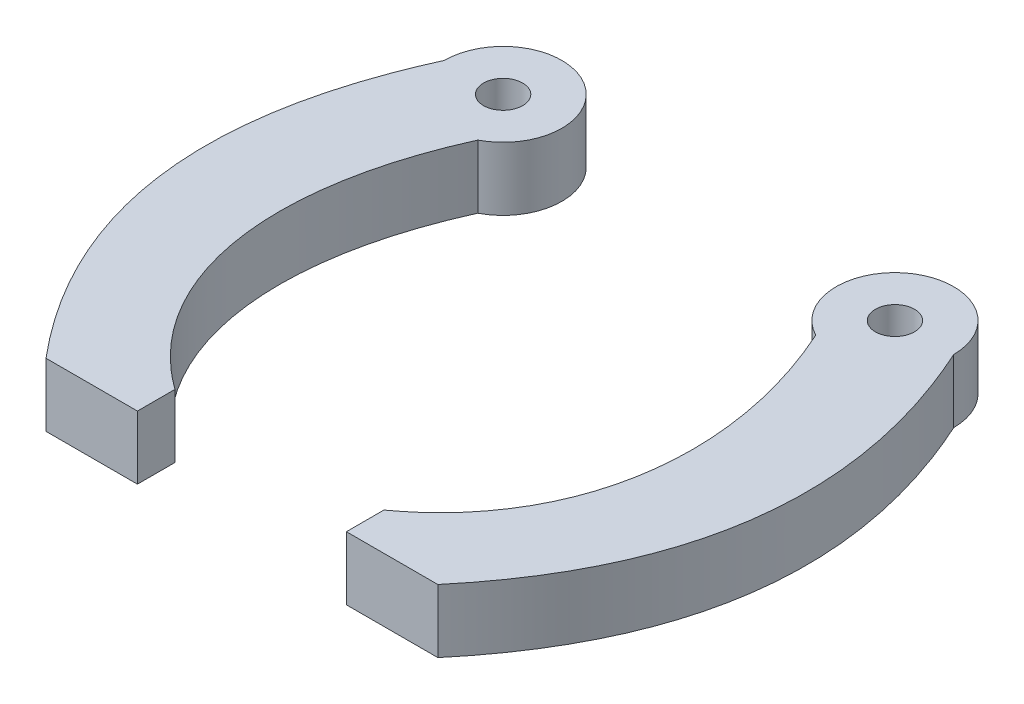
ISO-10303-21;
HEADER;
FILE_DESCRIPTION(('STEP AP214'),'2;1');
FILE_NAME('part.step','',(''),(''),'','','');
FILE_SCHEMA(('AUTOMOTIVE_DESIGN { 1 0 10303 214 1 1 1 1 }'));
ENDSEC;
DATA;
#1=APPLICATION_CONTEXT('core data for automotive mechanical design processes');
#2=APPLICATION_PROTOCOL_DEFINITION('international standard','automotive_design',2000,#1);
#3=PRODUCT_CONTEXT('',#1,'mechanical');
#4=PRODUCT('Part','Part','',(#3));
#5=PRODUCT_RELATED_PRODUCT_CATEGORY('part','',(#4));
#6=PRODUCT_DEFINITION_FORMATION('','',#4);
#7=PRODUCT_DEFINITION_CONTEXT('part definition',#1,'design');
#8=PRODUCT_DEFINITION('design','',#6,#7);
#9=PRODUCT_DEFINITION_SHAPE('','',#8);
#10=(LENGTH_UNIT() NAMED_UNIT(*) SI_UNIT(.MILLI.,.METRE.));
#11=(NAMED_UNIT(*) PLANE_ANGLE_UNIT() SI_UNIT($,.RADIAN.));
#12=(NAMED_UNIT(*) SI_UNIT($,.STERADIAN.) SOLID_ANGLE_UNIT());
#13=UNCERTAINTY_MEASURE_WITH_UNIT(LENGTH_MEASURE(1.E-05),#10,'distance_accuracy_value','');
#14=(GEOMETRIC_REPRESENTATION_CONTEXT(3) GLOBAL_UNCERTAINTY_ASSIGNED_CONTEXT((#13)) GLOBAL_UNIT_ASSIGNED_CONTEXT((#10,
#11,#12)) REPRESENTATION_CONTEXT('',''));
#15=CARTESIAN_POINT('',(0.,0.,0.));
#16=DIRECTION('',(0.,0.,1.));
#17=DIRECTION('',(1.,0.,0.));
#18=AXIS2_PLACEMENT_3D('',#15,#16,#17);
#19=CARTESIAN_POINT('',(0.,9.7,70.));
#20=DIRECTION('',(0.,0.,-1.));
#21=DIRECTION('',(-1.,0.,0.));
#22=AXIS2_PLACEMENT_3D('',#19,#20,#21);
#23=PLANE('',#22);
#24=DIRECTION('',(1.,0.,0.));
#25=VECTOR('',#24,1.);
#26=CARTESIAN_POINT('',(0.,0.,70.));
#27=LINE('',#26,#25);
#28=CARTESIAN_POINT('',(16.,0.,70.));
#29=VERTEX_POINT('',#28);
#30=CARTESIAN_POINT('',(30.,0.,70.));
#31=VERTEX_POINT('',#30);
#32=EDGE_CURVE('E153',#29,#31,#27,.T.);
#33=ORIENTED_EDGE('',*,*,#32,.T.);
#34=DIRECTION('',(0.,-1.,0.));
#35=VECTOR('',#34,1.);
#36=CARTESIAN_POINT('',(30.,9.7,70.));
#37=LINE('',#36,#35);
#38=CARTESIAN_POINT('',(30.,9.7,70.));
#39=VERTEX_POINT('',#38);
#40=EDGE_CURVE('E12',#39,#31,#37,.T.);
#41=ORIENTED_EDGE('',*,*,#40,.F.);
#42=DIRECTION('',(1.,0.,0.));
#43=VECTOR('',#42,1.);
#44=CARTESIAN_POINT('',(0.,9.7,70.));
#45=LINE('',#44,#43);
#46=CARTESIAN_POINT('',(16.,9.7,70.));
#47=VERTEX_POINT('',#46);
#48=EDGE_CURVE('E123',#47,#39,#45,.T.);
#49=ORIENTED_EDGE('',*,*,#48,.F.);
#50=DIRECTION('',(0.,-1.,0.));
#51=VECTOR('',#50,1.);
#52=CARTESIAN_POINT('',(16.,9.7,70.));
#53=LINE('',#52,#51);
#54=EDGE_CURVE('E67',#47,#29,#53,.T.);
#55=ORIENTED_EDGE('',*,*,#54,.T.);
#56=EDGE_LOOP('',(#33,#41,#49,#55));
#57=FACE_BOUND('',#56,.T.);
#58=ADVANCED_FACE('F51',(#57),#23,.F.);
#59=CARTESIAN_POINT('',(30.,9.7,70.));
#60=CARTESIAN_POINT('',(56.5320802679145,9.7,38.4962963409047));
#61=CARTESIAN_POINT('',(39.,9.7,0.));
#62=B_SPLINE_CURVE_WITH_KNOTS('',2,(#59,#60,#61),.UNSPECIFIED.,.F.,.F.,(3,3),(0.,1.),.UNSPECIFIED.);
#63=DIRECTION('',(0.,-1.,0.));
#64=VECTOR('',#63,1.);
#65=SURFACE_OF_LINEAR_EXTRUSION('',#62,#64);
#66=CARTESIAN_POINT('',(30.,0.,70.));
#67=CARTESIAN_POINT('',(56.5320802679145,0.,38.4962963409047));
#68=CARTESIAN_POINT('',(39.,0.,0.));
#69=B_SPLINE_CURVE_WITH_KNOTS('',2,(#66,#67,#68),.UNSPECIFIED.,.F.,.F.,(3,3),(0.,1.),.UNSPECIFIED.);
#70=CARTESIAN_POINT('',(39.,0.,0.));
#71=VERTEX_POINT('',#70);
#72=EDGE_CURVE('E150',#31,#71,#69,.T.);
#73=ORIENTED_EDGE('',*,*,#72,.T.);
#74=DIRECTION('',(0.,-1.,0.));
#75=VECTOR('',#74,1.);
#76=CARTESIAN_POINT('',(39.,9.7,0.));
#77=LINE('',#76,#75);
#78=CARTESIAN_POINT('',(39.,9.7,0.));
#79=VERTEX_POINT('',#78);
#80=EDGE_CURVE('E59',#79,#71,#77,.T.);
#81=ORIENTED_EDGE('',*,*,#80,.F.);
#82=EDGE_CURVE('E97',#39,#79,#62,.T.);
#83=ORIENTED_EDGE('',*,*,#82,.F.);
#84=ORIENTED_EDGE('',*,*,#40,.T.);
#85=EDGE_LOOP('',(#73,#81,#83,#84));
#86=FACE_BOUND('',#85,.T.);
#87=ADVANCED_FACE('F144',(#86),#65,.F.);
#88=CARTESIAN_POINT('',(30.,9.7,0.));
#89=DIRECTION('',(0.,-1.,0.));
#90=DIRECTION('',(0.,0.,-1.));
#91=AXIS2_PLACEMENT_3D('',#88,#89,#90);
#92=CYLINDRICAL_SURFACE('',#91,9.);
#93=CARTESIAN_POINT('',(30.,0.,0.));
#94=DIRECTION('',(0.,1.,0.));
#95=DIRECTION('',(0.,0.,1.));
#96=AXIS2_PLACEMENT_3D('',#93,#94,#95);
#97=CIRCLE('',#96,9.);
#98=CARTESIAN_POINT('',(25.8768943743823,0.,8.));
#99=VERTEX_POINT('',#98);
#100=EDGE_CURVE('E110',#99,#71,#97,.F.);
#101=ORIENTED_EDGE('',*,*,#100,.F.);
#102=DIRECTION('',(0.,-1.,0.));
#103=VECTOR('',#102,1.);
#104=CARTESIAN_POINT('',(25.8768943743823,9.7,8.));
#105=LINE('',#104,#103);
#106=CARTESIAN_POINT('',(25.8768943743823,9.7,8.));
#107=VERTEX_POINT('',#106);
#108=EDGE_CURVE('E104',#107,#99,#105,.T.);
#109=ORIENTED_EDGE('',*,*,#108,.F.);
#110=CARTESIAN_POINT('',(30.,9.7,0.));
#111=DIRECTION('',(0.,1.,0.));
#112=DIRECTION('',(0.,0.,1.));
#113=AXIS2_PLACEMENT_3D('',#110,#111,#112);
#114=CIRCLE('',#113,9.);
#115=EDGE_CURVE('E108',#107,#79,#114,.F.);
#116=ORIENTED_EDGE('',*,*,#115,.T.);
#117=ORIENTED_EDGE('',*,*,#80,.T.);
#118=EDGE_LOOP('',(#101,#109,#116,#117));
#119=FACE_BOUND('',#118,.T.);
#120=ADVANCED_FACE('F106',(#119),#92,.T.);
#121=CARTESIAN_POINT('',(25.8768943743823,9.7,7.99999999999999));
#122=CARTESIAN_POINT('',(38.13833064304,9.7,35.1787826079843));
#123=CARTESIAN_POINT('',(30.5110436937239,9.7,60.7072738572055));
#124=CARTESIAN_POINT('',(5.,9.7,70.));
#125=B_SPLINE_CURVE_WITH_KNOTS('',3,(#121,#122,#123,#124),.UNSPECIFIED.,.F.,.F.,(4,4),
(0.0853684692302398,1.),.UNSPECIFIED.);
#126=DIRECTION('',(0.,-1.,0.));
#127=VECTOR('',#126,1.);
#128=SURFACE_OF_LINEAR_EXTRUSION('',#125,#127);
#129=CARTESIAN_POINT('',(25.8768943743823,0.,7.99999999999999));
#130=CARTESIAN_POINT('',(38.13833064304,0.,35.1787826079843));
#131=CARTESIAN_POINT('',(30.5110436937239,0.,60.7072738572055));
#132=CARTESIAN_POINT('',(5.,0.,70.));
#133=B_SPLINE_CURVE_WITH_KNOTS('',3,(#129,#130,#131,#132),.UNSPECIFIED.,.F.,.F.,(4,4),
(0.0853684692302398,1.),.UNSPECIFIED.);
#134=CARTESIAN_POINT('',(16.,0.,64.2543621925921));
#135=VERTEX_POINT('',#134);
#136=EDGE_CURVE('E158',#99,#135,#133,.T.);
#137=ORIENTED_EDGE('',*,*,#136,.T.);
#138=DIRECTION('',(0.,-1.,0.));
#139=VECTOR('',#138,1.);
#140=CARTESIAN_POINT('',(16.,9.7,64.2543621925921));
#141=LINE('',#140,#139);
#142=CARTESIAN_POINT('',(16.,9.7,64.2543621925921));
#143=VERTEX_POINT('',#142);
#144=EDGE_CURVE('E85',#143,#135,#141,.T.);
#145=ORIENTED_EDGE('',*,*,#144,.F.);
#146=EDGE_CURVE('E114',#107,#143,#125,.T.);
#147=ORIENTED_EDGE('',*,*,#146,.F.);
#148=ORIENTED_EDGE('',*,*,#108,.T.);
#149=EDGE_LOOP('',(#137,#145,#147,#148));
#150=FACE_BOUND('',#149,.T.);
#151=ADVANCED_FACE('F115',(#150),#128,.F.);
#152=CARTESIAN_POINT('',(16.,9.7,0.));
#153=DIRECTION('',(-1.,0.,0.));
#154=DIRECTION('',(0.,0.,1.));
#155=AXIS2_PLACEMENT_3D('',#152,#153,#154);
#156=PLANE('',#155);
#157=DIRECTION('',(0.,0.,-1.));
#158=VECTOR('',#157,1.);
#159=CARTESIAN_POINT('',(16.,0.,0.));
#160=LINE('',#159,#158);
#161=EDGE_CURVE('E160',#29,#135,#160,.T.);
#162=ORIENTED_EDGE('',*,*,#161,.F.);
#163=ORIENTED_EDGE('',*,*,#54,.F.);
#164=DIRECTION('',(0.,0.,-1.));
#165=VECTOR('',#164,1.);
#166=CARTESIAN_POINT('',(16.,9.7,0.));
#167=LINE('',#166,#165);
#168=EDGE_CURVE('E118',#47,#143,#167,.T.);
#169=ORIENTED_EDGE('',*,*,#168,.T.);
#170=ORIENTED_EDGE('',*,*,#144,.T.);
#171=EDGE_LOOP('',(#162,#163,#169,#170));
#172=FACE_BOUND('',#171,.T.);
#173=ADVANCED_FACE('F141',(#172),#156,.T.);
#174=CARTESIAN_POINT('',(30.,9.7,0.));
#175=DIRECTION('',(0.,-1.,0.));
#176=DIRECTION('',(0.,0.,-1.));
#177=AXIS2_PLACEMENT_3D('',#174,#175,#176);
#178=CYLINDRICAL_SURFACE('',#177,3.);
#179=CARTESIAN_POINT('',(30.,9.7,0.));
#180=DIRECTION('',(0.,1.,0.));
#181=DIRECTION('',(0.,0.,1.));
#182=AXIS2_PLACEMENT_3D('',#179,#180,#181);
#183=CIRCLE('',#182,3.);
#184=CARTESIAN_POINT('',(30.,9.7,3.));
#185=VERTEX_POINT('',#184);
#186=EDGE_CURVE('E176',#185,#185,#183,.F.);
#187=ORIENTED_EDGE('',*,*,#186,.F.);
#188=EDGE_LOOP('',(#187));
#189=FACE_BOUND('',#188,.T.);
#190=CARTESIAN_POINT('',(30.,0.,0.));
#191=DIRECTION('',(0.,1.,0.));
#192=DIRECTION('',(0.,0.,1.));
#193=AXIS2_PLACEMENT_3D('',#190,#191,#192);
#194=CIRCLE('',#193,3.);
#195=CARTESIAN_POINT('',(30.,0.,3.));
#196=VERTEX_POINT('',#195);
#197=EDGE_CURVE('E172',#196,#196,#194,.F.);
#198=ORIENTED_EDGE('',*,*,#197,.T.);
#199=EDGE_LOOP('',(#198));
#200=FACE_BOUND('',#199,.T.);
#201=ADVANCED_FACE('F180',(#189,#200),#178,.F.);
#202=CARTESIAN_POINT('',(0.,9.7,0.));
#203=DIRECTION('',(0.,1.,0.));
#204=DIRECTION('',(0.,0.,1.));
#205=AXIS2_PLACEMENT_3D('',#202,#203,#204);
#206=PLANE('',#205);
#207=ORIENTED_EDGE('',*,*,#48,.T.);
#208=ORIENTED_EDGE('',*,*,#82,.T.);
#209=ORIENTED_EDGE('',*,*,#115,.F.);
#210=ORIENTED_EDGE('',*,*,#146,.T.);
#211=ORIENTED_EDGE('',*,*,#168,.F.);
#212=EDGE_LOOP('',(#207,#208,#209,#210,#211));
#213=FACE_BOUND('',#212,.T.);
#214=ORIENTED_EDGE('',*,*,#186,.T.);
#215=EDGE_LOOP('',(#214));
#216=FACE_BOUND('',#215,.T.);
#217=ADVANCED_FACE('F120',(#213,#216),#206,.T.);
#218=CARTESIAN_POINT('',(0.,0.,0.));
#219=DIRECTION('',(0.,1.,0.));
#220=DIRECTION('',(0.,0.,1.));
#221=AXIS2_PLACEMENT_3D('',#218,#219,#220);
#222=PLANE('',#221);
#223=ORIENTED_EDGE('',*,*,#32,.F.);
#224=ORIENTED_EDGE('',*,*,#161,.T.);
#225=ORIENTED_EDGE('',*,*,#136,.F.);
#226=ORIENTED_EDGE('',*,*,#100,.T.);
#227=ORIENTED_EDGE('',*,*,#72,.F.);
#228=EDGE_LOOP('',(#223,#224,#225,#226,#227));
#229=FACE_BOUND('',#228,.T.);
#230=ORIENTED_EDGE('',*,*,#197,.F.);
#231=EDGE_LOOP('',(#230));
#232=FACE_BOUND('',#231,.T.);
#233=ADVANCED_FACE('F155',(#229,#232),#222,.F.);
#234=CLOSED_SHELL('',(#58,#87,#120,#151,#173,#201,#217,#233));
#235=MANIFOLD_SOLID_BREP('B2',#234);
#236=CARTESIAN_POINT('',(-25.8768943743823,9.7,8.));
#237=CARTESIAN_POINT('',(-38.13833064304,9.7,35.1787826079843));
#238=CARTESIAN_POINT('',(-30.5110436937239,9.7,60.7072738572056));
#239=CARTESIAN_POINT('',(-4.99999999999999,9.7,70.));
#240=B_SPLINE_CURVE_WITH_KNOTS('',3,(#236,#237,#238,#239),.UNSPECIFIED.,.F.,.F.,(4,4),
(0.0853684692302398,1.),.UNSPECIFIED.);
#241=DIRECTION('',(0.,-1.,0.));
#242=VECTOR('',#241,1.);
#243=SURFACE_OF_LINEAR_EXTRUSION('',#240,#242);
#244=CARTESIAN_POINT('',(-25.8768943743823,0.,8.));
#245=CARTESIAN_POINT('',(-38.13833064304,0.,35.1787826079843));
#246=CARTESIAN_POINT('',(-30.5110436937239,0.,60.7072738572056));
#247=CARTESIAN_POINT('',(-4.99999999999999,0.,70.));
#248=B_SPLINE_CURVE_WITH_KNOTS('',3,(#244,#245,#246,#247),.UNSPECIFIED.,.F.,.F.,(4,4),
(0.0853684692302398,1.),.UNSPECIFIED.);
#249=CARTESIAN_POINT('',(-25.8768943743823,0.,8.00000000000001));
#250=VERTEX_POINT('',#249);
#251=CARTESIAN_POINT('',(-16.,0.,64.2543621925921));
#252=VERTEX_POINT('',#251);
#253=EDGE_CURVE('E337',#250,#252,#248,.T.);
#254=ORIENTED_EDGE('',*,*,#253,.F.);
#255=DIRECTION('',(0.,-1.,0.));
#256=VECTOR('',#255,1.);
#257=CARTESIAN_POINT('',(-25.8768943743823,9.7,8.00000000000001));
#258=LINE('',#257,#256);
#259=CARTESIAN_POINT('',(-25.8768943743823,9.7,8.00000000000001));
#260=VERTEX_POINT('',#259);
#261=EDGE_CURVE('E49',#260,#250,#258,.T.);
#262=ORIENTED_EDGE('',*,*,#261,.F.);
#263=CARTESIAN_POINT('',(-16.,9.7,64.2543621925921));
#264=VERTEX_POINT('',#263);
#265=EDGE_CURVE('E367',#260,#264,#240,.T.);
#266=ORIENTED_EDGE('',*,*,#265,.T.);
#267=DIRECTION('',(0.,-1.,0.));
#268=VECTOR('',#267,1.);
#269=CARTESIAN_POINT('',(-16.,9.7,64.2543621925921));
#270=LINE('',#269,#268);
#271=EDGE_CURVE('E293',#264,#252,#270,.T.);
#272=ORIENTED_EDGE('',*,*,#271,.T.);
#273=EDGE_LOOP('',(#254,#262,#266,#272));
#274=FACE_BOUND('',#273,.T.);
#275=ADVANCED_FACE('F250',(#274),#243,.T.);
#276=CARTESIAN_POINT('',(-30.,9.7,0.));
#277=DIRECTION('',(0.,-1.,0.));
#278=DIRECTION('',(0.,0.,-1.));
#279=AXIS2_PLACEMENT_3D('',#276,#277,#278);
#280=CYLINDRICAL_SURFACE('',#279,9.);
#281=CARTESIAN_POINT('',(-30.,0.,0.));
#282=DIRECTION('',(0.,1.,0.));
#283=DIRECTION('',(0.,0.,1.));
#284=AXIS2_PLACEMENT_3D('',#281,#282,#283);
#285=CIRCLE('',#284,9.);
#286=CARTESIAN_POINT('',(-39.,0.,0.));
#287=VERTEX_POINT('',#286);
#288=EDGE_CURVE('E343',#250,#287,#285,.T.);
#289=ORIENTED_EDGE('',*,*,#288,.T.);
#290=DIRECTION('',(0.,-1.,0.));
#291=VECTOR('',#290,1.);
#292=CARTESIAN_POINT('',(-39.,9.7,0.));
#293=LINE('',#292,#291);
#294=CARTESIAN_POINT('',(-39.,9.7,0.));
#295=VERTEX_POINT('',#294);
#296=EDGE_CURVE('E260',#295,#287,#293,.T.);
#297=ORIENTED_EDGE('',*,*,#296,.F.);
#298=CARTESIAN_POINT('',(-30.,9.7,0.));
#299=DIRECTION('',(0.,1.,0.));
#300=DIRECTION('',(0.,0.,1.));
#301=AXIS2_PLACEMENT_3D('',#298,#299,#300);
#302=CIRCLE('',#301,9.);
#303=EDGE_CURVE('E319',#260,#295,#302,.T.);
#304=ORIENTED_EDGE('',*,*,#303,.F.);
#305=ORIENTED_EDGE('',*,*,#261,.T.);
#306=EDGE_LOOP('',(#289,#297,#304,#305));
#307=FACE_BOUND('',#306,.T.);
#308=ADVANCED_FACE('F374',(#307),#280,.T.);
#309=CARTESIAN_POINT('',(-30.,9.7,70.));
#310=CARTESIAN_POINT('',(-56.5320802679145,9.7,38.4962963409047));
#311=CARTESIAN_POINT('',(-39.,9.7,0.));
#312=B_SPLINE_CURVE_WITH_KNOTS('',2,(#309,#310,#311),.UNSPECIFIED.,.F.,.F.,(3,3),(0.,1.),.UNSPECIFIED.);
#313=DIRECTION('',(0.,-1.,0.));
#314=VECTOR('',#313,1.);
#315=SURFACE_OF_LINEAR_EXTRUSION('',#312,#314);
#316=CARTESIAN_POINT('',(-30.,0.,70.));
#317=CARTESIAN_POINT('',(-56.5320802679145,0.,38.4962963409047));
#318=CARTESIAN_POINT('',(-39.,0.,0.));
#319=B_SPLINE_CURVE_WITH_KNOTS('',2,(#316,#317,#318),.UNSPECIFIED.,.F.,.F.,(3,3),(0.,1.),.UNSPECIFIED.);
#320=CARTESIAN_POINT('',(-30.,0.,70.));
#321=VERTEX_POINT('',#320);
#322=EDGE_CURVE('E309',#321,#287,#319,.T.);
#323=ORIENTED_EDGE('',*,*,#322,.F.);
#324=DIRECTION('',(0.,-1.,0.));
#325=VECTOR('',#324,1.);
#326=CARTESIAN_POINT('',(-30.,9.7,70.));
#327=LINE('',#326,#325);
#328=CARTESIAN_POINT('',(-30.,9.7,70.));
#329=VERTEX_POINT('',#328);
#330=EDGE_CURVE('E304',#329,#321,#327,.T.);
#331=ORIENTED_EDGE('',*,*,#330,.F.);
#332=EDGE_CURVE('E307',#329,#295,#312,.T.);
#333=ORIENTED_EDGE('',*,*,#332,.T.);
#334=ORIENTED_EDGE('',*,*,#296,.T.);
#335=EDGE_LOOP('',(#323,#331,#333,#334));
#336=FACE_BOUND('',#335,.T.);
#337=ADVANCED_FACE('F306',(#336),#315,.T.);
#338=CARTESIAN_POINT('',(0.,9.7,70.));
#339=DIRECTION('',(0.,0.,1.));
#340=DIRECTION('',(1.,0.,0.));
#341=AXIS2_PLACEMENT_3D('',#338,#339,#340);
#342=PLANE('',#341);
#343=DIRECTION('',(-1.,0.,0.));
#344=VECTOR('',#343,1.);
#345=CARTESIAN_POINT('',(0.,0.,70.));
#346=LINE('',#345,#344);
#347=CARTESIAN_POINT('',(-16.,0.,70.));
#348=VERTEX_POINT('',#347);
#349=EDGE_CURVE('E354',#348,#321,#346,.T.);
#350=ORIENTED_EDGE('',*,*,#349,.F.);
#351=DIRECTION('',(0.,-1.,0.));
#352=VECTOR('',#351,1.);
#353=CARTESIAN_POINT('',(-16.,9.7,70.));
#354=LINE('',#353,#352);
#355=CARTESIAN_POINT('',(-16.,9.7,70.));
#356=VERTEX_POINT('',#355);
#357=EDGE_CURVE('E286',#356,#348,#354,.T.);
#358=ORIENTED_EDGE('',*,*,#357,.F.);
#359=DIRECTION('',(-1.,0.,0.));
#360=VECTOR('',#359,1.);
#361=CARTESIAN_POINT('',(0.,9.7,70.));
#362=LINE('',#361,#360);
#363=EDGE_CURVE('E318',#356,#329,#362,.T.);
#364=ORIENTED_EDGE('',*,*,#363,.T.);
#365=ORIENTED_EDGE('',*,*,#330,.T.);
#366=EDGE_LOOP('',(#350,#358,#364,#365));
#367=FACE_BOUND('',#366,.T.);
#368=ADVANCED_FACE('F323',(#367),#342,.T.);
#369=CARTESIAN_POINT('',(-16.,9.7,0.));
#370=DIRECTION('',(-1.,0.,0.));
#371=DIRECTION('',(0.,0.,1.));
#372=AXIS2_PLACEMENT_3D('',#369,#370,#371);
#373=PLANE('',#372);
#374=DIRECTION('',(0.,0.,-1.));
#375=VECTOR('',#374,1.);
#376=CARTESIAN_POINT('',(-16.,0.,0.));
#377=LINE('',#376,#375);
#378=EDGE_CURVE('E360',#348,#252,#377,.T.);
#379=ORIENTED_EDGE('',*,*,#378,.T.);
#380=ORIENTED_EDGE('',*,*,#271,.F.);
#381=DIRECTION('',(0.,0.,-1.));
#382=VECTOR('',#381,1.);
#383=CARTESIAN_POINT('',(-16.,9.7,0.));
#384=LINE('',#383,#382);
#385=EDGE_CURVE('E268',#356,#264,#384,.T.);
#386=ORIENTED_EDGE('',*,*,#385,.F.);
#387=ORIENTED_EDGE('',*,*,#357,.T.);
#388=EDGE_LOOP('',(#379,#380,#386,#387));
#389=FACE_BOUND('',#388,.T.);
#390=ADVANCED_FACE('F378',(#389),#373,.F.);
#391=CARTESIAN_POINT('',(-30.,9.7,0.));
#392=DIRECTION('',(0.,-1.,0.));
#393=DIRECTION('',(0.,0.,-1.));
#394=AXIS2_PLACEMENT_3D('',#391,#392,#393);
#395=CYLINDRICAL_SURFACE('',#394,3.);
#396=CARTESIAN_POINT('',(-30.,9.7,0.));
#397=DIRECTION('',(0.,1.,0.));
#398=DIRECTION('',(0.,0.,1.));
#399=AXIS2_PLACEMENT_3D('',#396,#397,#398);
#400=CIRCLE('',#399,3.);
#401=CARTESIAN_POINT('',(-30.,9.7,3.00000000000001));
#402=VERTEX_POINT('',#401);
#403=EDGE_CURVE('E327',#402,#402,#400,.T.);
#404=ORIENTED_EDGE('',*,*,#403,.T.);
#405=EDGE_LOOP('',(#404));
#406=FACE_BOUND('',#405,.T.);
#407=CARTESIAN_POINT('',(-30.,0.,0.));
#408=DIRECTION('',(0.,1.,0.));
#409=DIRECTION('',(0.,0.,1.));
#410=AXIS2_PLACEMENT_3D('',#407,#408,#409);
#411=CIRCLE('',#410,3.);
#412=CARTESIAN_POINT('',(-30.,0.,3.00000000000001));
#413=VERTEX_POINT('',#412);
#414=EDGE_CURVE('E363',#413,#413,#411,.T.);
#415=ORIENTED_EDGE('',*,*,#414,.F.);
#416=EDGE_LOOP('',(#415));
#417=FACE_BOUND('',#416,.T.);
#418=ADVANCED_FACE('F400',(#406,#417),#395,.F.);
#419=CARTESIAN_POINT('',(0.,9.7,0.));
#420=DIRECTION('',(0.,1.,0.));
#421=DIRECTION('',(0.,0.,1.));
#422=AXIS2_PLACEMENT_3D('',#419,#420,#421);
#423=PLANE('',#422);
#424=ORIENTED_EDGE('',*,*,#265,.F.);
#425=ORIENTED_EDGE('',*,*,#303,.T.);
#426=ORIENTED_EDGE('',*,*,#332,.F.);
#427=ORIENTED_EDGE('',*,*,#363,.F.);
#428=ORIENTED_EDGE('',*,*,#385,.T.);
#429=EDGE_LOOP('',(#424,#425,#426,#427,#428));
#430=FACE_BOUND('',#429,.T.);
#431=ORIENTED_EDGE('',*,*,#403,.F.);
#432=EDGE_LOOP('',(#431));
#433=FACE_BOUND('',#432,.T.);
#434=ADVANCED_FACE('F316',(#430,#433),#423,.T.);
#435=CARTESIAN_POINT('',(0.,0.,0.));
#436=DIRECTION('',(0.,1.,0.));
#437=DIRECTION('',(0.,0.,1.));
#438=AXIS2_PLACEMENT_3D('',#435,#436,#437);
#439=PLANE('',#438);
#440=ORIENTED_EDGE('',*,*,#253,.T.);
#441=ORIENTED_EDGE('',*,*,#378,.F.);
#442=ORIENTED_EDGE('',*,*,#349,.T.);
#443=ORIENTED_EDGE('',*,*,#322,.T.);
#444=ORIENTED_EDGE('',*,*,#288,.F.);
#445=EDGE_LOOP('',(#440,#441,#442,#443,#444));
#446=FACE_BOUND('',#445,.T.);
#447=ORIENTED_EDGE('',*,*,#414,.T.);
#448=EDGE_LOOP('',(#447));
#449=FACE_BOUND('',#448,.T.);
#450=ADVANCED_FACE('F376',(#446,#449),#439,.F.);
#451=CLOSED_SHELL('',(#275,#308,#337,#368,#390,#418,#434,#450));
#452=MANIFOLD_SOLID_BREP('B6',#451);
#453=ADVANCED_BREP_SHAPE_REPRESENTATION('',(#18,#235,#452),#14);
#454=SHAPE_DEFINITION_REPRESENTATION(#9,#453);
ENDSEC;
END-ISO-10303-21;
